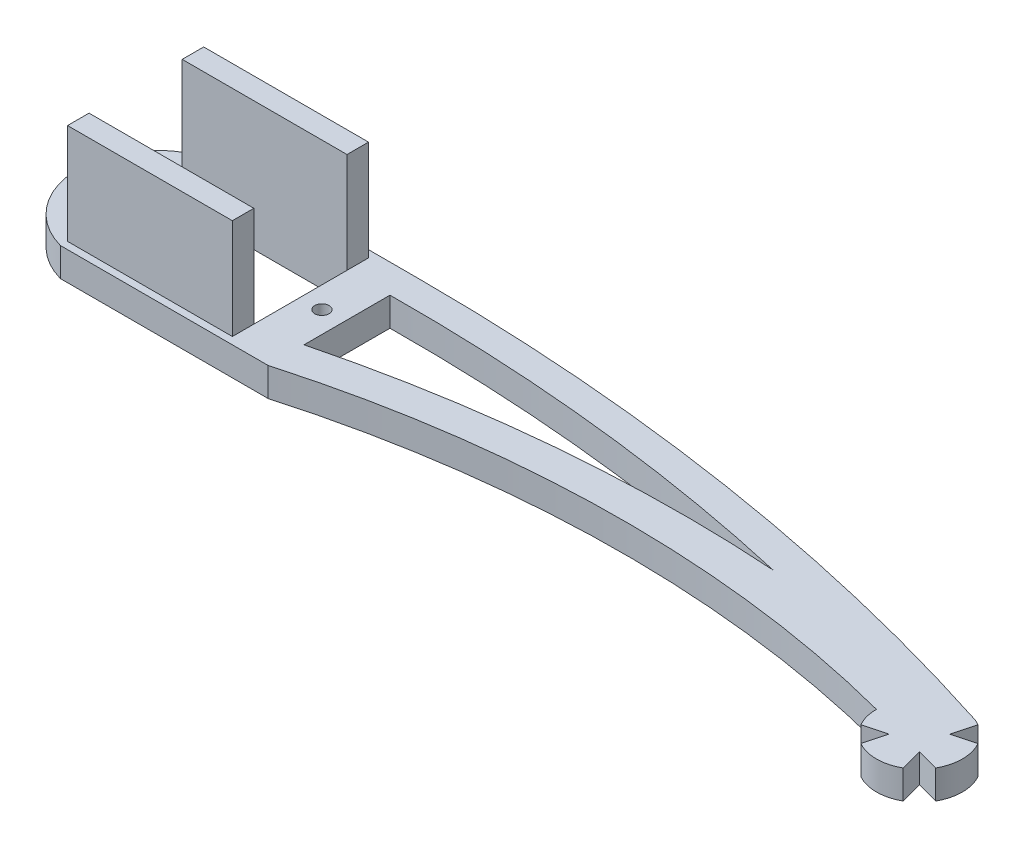
ISO-10303-21;
HEADER;
FILE_DESCRIPTION(('STEP AP214'),'2;1');
FILE_NAME('part.step','',(''),(''),'','','');
FILE_SCHEMA(('AUTOMOTIVE_DESIGN { 1 0 10303 214 1 1 1 1 }'));
ENDSEC;
DATA;
#1=APPLICATION_CONTEXT('core data for automotive mechanical design processes');
#2=APPLICATION_PROTOCOL_DEFINITION('international standard','automotive_design',2000,#1);
#3=PRODUCT_CONTEXT('',#1,'mechanical');
#4=PRODUCT('Part','Part','',(#3));
#5=PRODUCT_RELATED_PRODUCT_CATEGORY('part','',(#4));
#6=PRODUCT_DEFINITION_FORMATION('','',#4);
#7=PRODUCT_DEFINITION_CONTEXT('part definition',#1,'design');
#8=PRODUCT_DEFINITION('design','',#6,#7);
#9=PRODUCT_DEFINITION_SHAPE('','',#8);
#10=(LENGTH_UNIT() NAMED_UNIT(*) SI_UNIT(.MILLI.,.METRE.));
#11=(NAMED_UNIT(*) PLANE_ANGLE_UNIT() SI_UNIT($,.RADIAN.));
#12=(NAMED_UNIT(*) SI_UNIT($,.STERADIAN.) SOLID_ANGLE_UNIT());
#13=UNCERTAINTY_MEASURE_WITH_UNIT(LENGTH_MEASURE(1.E-05),#10,'distance_accuracy_value','');
#14=(GEOMETRIC_REPRESENTATION_CONTEXT(3) GLOBAL_UNCERTAINTY_ASSIGNED_CONTEXT((#13)) GLOBAL_UNIT_ASSIGNED_CONTEXT((#10,
#11,#12)) REPRESENTATION_CONTEXT('',''));
#15=CARTESIAN_POINT('',(0.,0.,0.));
#16=DIRECTION('',(0.,0.,1.));
#17=DIRECTION('',(1.,0.,0.));
#18=AXIS2_PLACEMENT_3D('',#15,#16,#17);
#19=CARTESIAN_POINT('',(0.,2.,0.));
#20=DIRECTION('',(0.,1.,0.));
#21=DIRECTION('',(0.,0.,1.));
#22=AXIS2_PLACEMENT_3D('',#19,#20,#21);
#23=PLANE('',#22);
#24=CARTESIAN_POINT('',(14.5,2.,0.));
#25=DIRECTION('',(0.,-1.,0.));
#26=DIRECTION('',(0.,0.,-1.));
#27=AXIS2_PLACEMENT_3D('',#24,#25,#26);
#28=CIRCLE('',#27,1.);
#29=CARTESIAN_POINT('',(14.5,2.,-1.));
#30=VERTEX_POINT('',#29);
#31=EDGE_CURVE('E349',#30,#30,#28,.T.);
#32=ORIENTED_EDGE('',*,*,#31,.T.);
#33=EDGE_LOOP('',(#32));
#34=FACE_BOUND('',#33,.T.);
#35=CARTESIAN_POINT('',(-14.5,2.,0.));
#36=DIRECTION('',(0.,-1.,0.));
#37=DIRECTION('',(0.,0.,-1.));
#38=AXIS2_PLACEMENT_3D('',#35,#36,#37);
#39=CIRCLE('',#38,1.);
#40=CARTESIAN_POINT('',(-14.5,2.,-1.));
#41=VERTEX_POINT('',#40);
#42=EDGE_CURVE('E346',#41,#41,#39,.T.);
#43=ORIENTED_EDGE('',*,*,#42,.T.);
#44=EDGE_LOOP('',(#43));
#45=FACE_BOUND('',#44,.T.);
#46=DIRECTION('',(-0.965925826289068,0.,0.258819045102521));
#47=VECTOR('',#46,1.);
#48=CARTESIAN_POINT('',(9.99294037609663,2.,37.294161200599));
#49=LINE('',#48,#47);
#50=CARTESIAN_POINT('',(105.37867965644,2.,11.7356293909852));
#51=VERTEX_POINT('',#50);
#52=CARTESIAN_POINT('',(102.27670660932,2.,12.5668005639042));
#53=VERTEX_POINT('',#52);
#54=EDGE_CURVE('E391',#51,#53,#49,.T.);
#55=ORIENTED_EDGE('',*,*,#54,.F.);
#56=DIRECTION('',(-0.258819045102517,0.,0.965925826289069));
#57=VECTOR('',#56,1.);
#58=CARTESIAN_POINT('',(101.253553975837,2.,27.1308080186061));
#59=LINE('',#58,#57);
#60=CARTESIAN_POINT('',(104.547508483521,2.,14.8376024381056));
#61=VERTEX_POINT('',#60);
#62=EDGE_CURVE('E397',#51,#61,#59,.T.);
#63=ORIENTED_EDGE('',*,*,#62,.T.);
#64=CARTESIAN_POINT('',(107.5,2.,9.61430904742555));
#65=DIRECTION('',(0.,1.,0.));
#66=DIRECTION('',(0.,0.,1.));
#67=AXIS2_PLACEMENT_3D('',#64,#65,#66);
#68=CIRCLE('',#67,6.00000000000002);
#69=CARTESIAN_POINT('',(110.452491516479,2.,14.8376024381056));
#70=VERTEX_POINT('',#69);
#71=EDGE_CURVE('E481',#61,#70,#68,.T.);
#72=ORIENTED_EDGE('',*,*,#71,.T.);
#73=DIRECTION('',(0.258819045102524,0.,0.965925826289067));
#74=VECTOR('',#73,1.);
#75=CARTESIAN_POINT('',(99.3441769309906,2.,-26.6191919813939));
#76=LINE('',#75,#74);
#77=CARTESIAN_POINT('',(109.62132034356,2.,11.7356293909852));
#78=VERTEX_POINT('',#77);
#79=EDGE_CURVE('E414',#78,#70,#76,.T.);
#80=ORIENTED_EDGE('',*,*,#79,.F.);
#81=DIRECTION('',(0.965925826289067,0.,0.258819045102525));
#82=VECTOR('',#81,1.);
#83=CARTESIAN_POINT('',(4.40932871707647,2.,-16.4558387994016));
#84=LINE('',#83,#82);
#85=CARTESIAN_POINT('',(112.72329339068,2.,12.5668005639042));
#86=VERTEX_POINT('',#85);
#87=EDGE_CURVE('E417',#78,#86,#84,.T.);
#88=ORIENTED_EDGE('',*,*,#87,.T.);
#89=CARTESIAN_POINT('',(112.72329339068,2.,6.66181753094687));
#90=VERTEX_POINT('',#89);
#91=EDGE_CURVE('E787',#86,#90,#68,.T.);
#92=ORIENTED_EDGE('',*,*,#91,.T.);
#93=DIRECTION('',(0.965925826289068,0.,-0.258819045102523));
#94=VECTOR('',#93,1.);
#95=CARTESIAN_POINT('',(9.2164832407892,2.,34.396383721732));
#96=LINE('',#95,#94);
#97=CARTESIAN_POINT('',(109.62132034356,2.,7.4929887038659));
#98=VERTEX_POINT('',#97);
#99=EDGE_CURVE('E431',#98,#90,#96,.T.);
#100=ORIENTED_EDGE('',*,*,#99,.F.);
#101=DIRECTION('',(0.258819045102529,0.,-0.965925826289066));
#102=VECTOR('',#101,1.);
#103=CARTESIAN_POINT('',(104.151331454703,2.,27.9072651539149));
#104=LINE('',#103,#102);
#105=CARTESIAN_POINT('',(110.452491516479,2.,4.39101565674553));
#106=VERTEX_POINT('',#105);
#107=EDGE_CURVE('E432',#98,#106,#104,.T.);
#108=ORIENTED_EDGE('',*,*,#107,.T.);
#109=CARTESIAN_POINT('',(109.336734693878,2.,3.90235617084239));
#110=VERTEX_POINT('',#109);
#111=EDGE_CURVE('E474',#106,#110,#68,.T.);
#112=ORIENTED_EDGE('',*,*,#111,.T.);
#113=CARTESIAN_POINT('',(17.5,2.,289.5));
#114=DIRECTION('',(0.,1.,0.));
#115=DIRECTION('',(0.,0.,1.));
#116=AXIS2_PLACEMENT_3D('',#113,#114,#115);
#117=CIRCLE('',#116,300.);
#118=CARTESIAN_POINT('',(17.5,2.,-10.5));
#119=VERTEX_POINT('',#118);
#120=EDGE_CURVE('E477',#119,#110,#117,.F.);
#121=ORIENTED_EDGE('',*,*,#120,.F.);
#122=DIRECTION('',(-1.,0.,0.));
#123=VECTOR('',#122,1.);
#124=CARTESIAN_POINT('',(0.,2.,-10.5));
#125=LINE('',#124,#123);
#126=CARTESIAN_POINT('',(-11.5,2.,-10.5));
#127=VERTEX_POINT('',#126);
#128=EDGE_CURVE('E514',#119,#127,#125,.T.);
#129=ORIENTED_EDGE('',*,*,#128,.T.);
#130=CARTESIAN_POINT('',(-8.60937499999999,2.,0.));
#131=DIRECTION('',(0.,1.,0.));
#132=DIRECTION('',(0.,0.,1.));
#133=AXIS2_PLACEMENT_3D('',#130,#131,#132);
#134=CIRCLE('',#133,10.890625);
#135=CARTESIAN_POINT('',(-11.5,2.,10.5));
#136=VERTEX_POINT('',#135);
#137=EDGE_CURVE('E504',#136,#127,#134,.F.);
#138=ORIENTED_EDGE('',*,*,#137,.F.);
#139=DIRECTION('',(-1.,0.,0.));
#140=VECTOR('',#139,1.);
#141=CARTESIAN_POINT('',(0.,2.,10.5));
#142=LINE('',#141,#140);
#143=CARTESIAN_POINT('',(17.5,2.,10.5));
#144=VERTEX_POINT('',#143);
#145=EDGE_CURVE('E502',#144,#136,#142,.T.);
#146=ORIENTED_EDGE('',*,*,#145,.F.);
#147=CARTESIAN_POINT('',(61.1277724137752,2.,164.437056858353));
#148=DIRECTION('',(0.,1.,0.));
#149=DIRECTION('',(0.,0.,1.));
#150=AXIS2_PLACEMENT_3D('',#147,#148,#149);
#151=CIRCLE('',#150,160.);
#152=CARTESIAN_POINT('',(101.5,2.,9.61430904742555));
#153=VERTEX_POINT('',#152);
#154=EDGE_CURVE('E473',#144,#153,#151,.F.);
#155=ORIENTED_EDGE('',*,*,#154,.T.);
#156=EDGE_CURVE('E478',#153,#53,#68,.T.);
#157=ORIENTED_EDGE('',*,*,#156,.T.);
#158=EDGE_LOOP('',(#55,#63,#72,#80,#88,#92,#100,#108,#112,#121,#129,#138,#146,#155,#157));
#159=FACE_BOUND('',#158,.T.);
#160=DIRECTION('',(0.,0.,-1.));
#161=VECTOR('',#160,1.);
#162=CARTESIAN_POINT('',(17.5,2.,0.));
#163=LINE('',#162,#161);
#164=CARTESIAN_POINT('',(17.5,2.,5.5));
#165=VERTEX_POINT('',#164);
#166=CARTESIAN_POINT('',(17.5,2.,-6.50000000000001));
#167=VERTEX_POINT('',#166);
#168=EDGE_CURVE('E507',#165,#167,#163,.T.);
#169=ORIENTED_EDGE('',*,*,#168,.T.);
#170=CARTESIAN_POINT('',(19.6864126009536,2.,253.490806760428));
#171=DIRECTION('',(0.,1.,0.));
#172=DIRECTION('',(0.,0.,1.));
#173=AXIS2_PLACEMENT_3D('',#170,#171,#172);
#174=CIRCLE('',#173,260.);
#175=CARTESIAN_POINT('',(77.5,2.,0.));
#176=VERTEX_POINT('',#175);
#177=EDGE_CURVE('E464',#167,#176,#174,.F.);
#178=ORIENTED_EDGE('',*,*,#177,.T.);
#179=CARTESIAN_POINT('',(64.6245471826558,2.,189.563241992609));
#180=DIRECTION('',(0.,1.,0.));
#181=DIRECTION('',(0.,0.,1.));
#182=AXIS2_PLACEMENT_3D('',#179,#180,#181);
#183=CIRCLE('',#182,190.);
#184=EDGE_CURVE('E411',#165,#176,#183,.F.);
#185=ORIENTED_EDGE('',*,*,#184,.F.);
#186=EDGE_LOOP('',(#169,#178,#185));
#187=FACE_BOUND('',#186,.T.);
#188=DIRECTION('',(0.,0.,-1.));
#189=VECTOR('',#188,1.);
#190=CARTESIAN_POINT('',(-11.5,2.,0.));
#191=LINE('',#190,#189);
#192=CARTESIAN_POINT('',(-11.5,2.,-3.));
#193=VERTEX_POINT('',#192);
#194=CARTESIAN_POINT('',(-11.5,2.,-6.5));
#195=VERTEX_POINT('',#194);
#196=EDGE_CURVE('E522',#193,#195,#191,.T.);
#197=ORIENTED_EDGE('',*,*,#196,.T.);
#198=DIRECTION('',(0.,0.,-1.));
#199=VECTOR('',#198,1.);
#200=CARTESIAN_POINT('',(-11.5,2.,-6.5));
#201=LINE('',#200,#199);
#202=CARTESIAN_POINT('',(-11.5,2.,-9.5));
#203=VERTEX_POINT('',#202);
#204=EDGE_CURVE('E266',#195,#203,#201,.T.);
#205=ORIENTED_EDGE('',*,*,#204,.T.);
#206=DIRECTION('',(1.,0.,0.));
#207=VECTOR('',#206,1.);
#208=CARTESIAN_POINT('',(-11.5,2.,-9.5));
#209=LINE('',#208,#207);
#210=CARTESIAN_POINT('',(11.5,2.,-9.5));
#211=VERTEX_POINT('',#210);
#212=EDGE_CURVE('E70',#203,#211,#209,.T.);
#213=ORIENTED_EDGE('',*,*,#212,.T.);
#214=DIRECTION('',(0.,0.,1.));
#215=VECTOR('',#214,1.);
#216=CARTESIAN_POINT('',(11.5,2.,-6.5));
#217=LINE('',#216,#215);
#218=CARTESIAN_POINT('',(11.5,2.,-6.5));
#219=VERTEX_POINT('',#218);
#220=EDGE_CURVE('E298',#211,#219,#217,.T.);
#221=ORIENTED_EDGE('',*,*,#220,.T.);
#222=DIRECTION('',(0.,0.,-1.));
#223=VECTOR('',#222,1.);
#224=CARTESIAN_POINT('',(11.5,2.,0.));
#225=LINE('',#224,#223);
#226=CARTESIAN_POINT('',(11.5,2.,6.5));
#227=VERTEX_POINT('',#226);
#228=EDGE_CURVE('E526',#227,#219,#225,.T.);
#229=ORIENTED_EDGE('',*,*,#228,.F.);
#230=DIRECTION('',(0.,0.,-1.));
#231=VECTOR('',#230,1.);
#232=CARTESIAN_POINT('',(11.5,2.,6.5));
#233=LINE('',#232,#231);
#234=CARTESIAN_POINT('',(11.5,2.,9.5));
#235=VERTEX_POINT('',#234);
#236=EDGE_CURVE('E316',#235,#227,#233,.T.);
#237=ORIENTED_EDGE('',*,*,#236,.F.);
#238=DIRECTION('',(1.,0.,0.));
#239=VECTOR('',#238,1.);
#240=CARTESIAN_POINT('',(-11.5,2.,9.5));
#241=LINE('',#240,#239);
#242=CARTESIAN_POINT('',(-11.5,2.,9.5));
#243=VERTEX_POINT('',#242);
#244=EDGE_CURVE('E74',#243,#235,#241,.T.);
#245=ORIENTED_EDGE('',*,*,#244,.F.);
#246=DIRECTION('',(0.,0.,1.));
#247=VECTOR('',#246,1.);
#248=CARTESIAN_POINT('',(-11.5,2.,6.5));
#249=LINE('',#248,#247);
#250=CARTESIAN_POINT('',(-11.5,2.,6.5));
#251=VERTEX_POINT('',#250);
#252=EDGE_CURVE('E271',#251,#243,#249,.T.);
#253=ORIENTED_EDGE('',*,*,#252,.F.);
#254=CARTESIAN_POINT('',(-11.5,2.,3.));
#255=VERTEX_POINT('',#254);
#256=EDGE_CURVE('E530',#251,#255,#191,.T.);
#257=ORIENTED_EDGE('',*,*,#256,.T.);
#258=DIRECTION('',(-1.,0.,0.));
#259=VECTOR('',#258,1.);
#260=CARTESIAN_POINT('',(0.,2.,3.));
#261=LINE('',#260,#259);
#262=CARTESIAN_POINT('',(-12.5,2.,3.));
#263=VERTEX_POINT('',#262);
#264=EDGE_CURVE('E531',#255,#263,#261,.T.);
#265=ORIENTED_EDGE('',*,*,#264,.T.);
#266=DIRECTION('',(0.,0.,1.));
#267=VECTOR('',#266,1.);
#268=CARTESIAN_POINT('',(-12.5,2.,0.));
#269=LINE('',#268,#267);
#270=CARTESIAN_POINT('',(-12.5,2.,-3.));
#271=VERTEX_POINT('',#270);
#272=EDGE_CURVE('E516',#271,#263,#269,.T.);
#273=ORIENTED_EDGE('',*,*,#272,.F.);
#274=DIRECTION('',(-1.,0.,0.));
#275=VECTOR('',#274,1.);
#276=CARTESIAN_POINT('',(0.,2.,-3.));
#277=LINE('',#276,#275);
#278=EDGE_CURVE('E523',#193,#271,#277,.T.);
#279=ORIENTED_EDGE('',*,*,#278,.F.);
#280=EDGE_LOOP('',(#197,#205,#213,#221,#229,#237,#245,#253,#257,#265,#273,#279));
#281=FACE_BOUND('',#280,.T.);
#282=ADVANCED_FACE('F50',(#34,#45,#159,#187,#281),#23,.T.);
#283=CARTESIAN_POINT('',(0.,-2.,0.));
#284=DIRECTION('',(0.,1.,0.));
#285=DIRECTION('',(0.,0.,1.));
#286=AXIS2_PLACEMENT_3D('',#283,#284,#285);
#287=PLANE('',#286);
#288=DIRECTION('',(-0.258819045102517,0.,0.965925826289069));
#289=VECTOR('',#288,1.);
#290=CARTESIAN_POINT('',(101.253553975837,-2.,27.1308080186061));
#291=LINE('',#290,#289);
#292=CARTESIAN_POINT('',(105.37867965644,-2.,11.7356293909852));
#293=VERTEX_POINT('',#292);
#294=CARTESIAN_POINT('',(104.547508483521,-2.,14.8376024381056));
#295=VERTEX_POINT('',#294);
#296=EDGE_CURVE('E402',#293,#295,#291,.T.);
#297=ORIENTED_EDGE('',*,*,#296,.F.);
#298=DIRECTION('',(-0.965925826289068,0.,0.25881904510252));
#299=VECTOR('',#298,1.);
#300=CARTESIAN_POINT('',(105.37867965644,-2.,11.7356293909852));
#301=LINE('',#300,#299);
#302=CARTESIAN_POINT('',(102.27670660932,-2.,12.5668005639042));
#303=VERTEX_POINT('',#302);
#304=EDGE_CURVE('E429',#293,#303,#301,.T.);
#305=ORIENTED_EDGE('',*,*,#304,.T.);
#306=CARTESIAN_POINT('',(107.5,-2.,9.61430904742555));
#307=DIRECTION('',(0.,1.,0.));
#308=DIRECTION('',(0.,0.,1.));
#309=AXIS2_PLACEMENT_3D('',#306,#307,#308);
#310=CIRCLE('',#309,6.00000000000002);
#311=CARTESIAN_POINT('',(101.5,-2.,9.61430904742555));
#312=VERTEX_POINT('',#311);
#313=EDGE_CURVE('E625',#312,#303,#310,.T.);
#314=ORIENTED_EDGE('',*,*,#313,.F.);
#315=CARTESIAN_POINT('',(61.1277724137752,-2.,164.437056858353));
#316=DIRECTION('',(0.,1.,0.));
#317=DIRECTION('',(0.,0.,1.));
#318=AXIS2_PLACEMENT_3D('',#315,#316,#317);
#319=CIRCLE('',#318,160.);
#320=CARTESIAN_POINT('',(17.5,-2.,10.5));
#321=VERTEX_POINT('',#320);
#322=EDGE_CURVE('E458',#321,#312,#319,.F.);
#323=ORIENTED_EDGE('',*,*,#322,.F.);
#324=DIRECTION('',(-1.,0.,0.));
#325=VECTOR('',#324,1.);
#326=CARTESIAN_POINT('',(0.,-2.,10.5));
#327=LINE('',#326,#325);
#328=CARTESIAN_POINT('',(-11.5,-2.,10.5));
#329=VERTEX_POINT('',#328);
#330=EDGE_CURVE('E539',#321,#329,#327,.T.);
#331=ORIENTED_EDGE('',*,*,#330,.T.);
#332=CARTESIAN_POINT('',(-8.60937499999999,-2.,0.));
#333=DIRECTION('',(0.,1.,0.));
#334=DIRECTION('',(0.,0.,1.));
#335=AXIS2_PLACEMENT_3D('',#332,#333,#334);
#336=CIRCLE('',#335,10.890625);
#337=CARTESIAN_POINT('',(-11.5,-2.,-10.5));
#338=VERTEX_POINT('',#337);
#339=EDGE_CURVE('E491',#329,#338,#336,.F.);
#340=ORIENTED_EDGE('',*,*,#339,.T.);
#341=DIRECTION('',(-1.,0.,0.));
#342=VECTOR('',#341,1.);
#343=CARTESIAN_POINT('',(0.,-2.,-10.5));
#344=LINE('',#343,#342);
#345=CARTESIAN_POINT('',(17.5,-2.,-10.5));
#346=VERTEX_POINT('',#345);
#347=EDGE_CURVE('E547',#346,#338,#344,.T.);
#348=ORIENTED_EDGE('',*,*,#347,.F.);
#349=CARTESIAN_POINT('',(17.5,-2.,289.5));
#350=DIRECTION('',(0.,1.,0.));
#351=DIRECTION('',(0.,0.,1.));
#352=AXIS2_PLACEMENT_3D('',#349,#350,#351);
#353=CIRCLE('',#352,300.);
#354=CARTESIAN_POINT('',(109.336734693878,-2.,3.90235617084239));
#355=VERTEX_POINT('',#354);
#356=EDGE_CURVE('E470',#346,#355,#353,.F.);
#357=ORIENTED_EDGE('',*,*,#356,.T.);
#358=CARTESIAN_POINT('',(107.5,-2.,9.61430904742555));
#359=DIRECTION('',(0.,1.,0.));
#360=DIRECTION('',(0.,0.,1.));
#361=AXIS2_PLACEMENT_3D('',#358,#359,#360);
#362=CIRCLE('',#361,6.00000000000002);
#363=CARTESIAN_POINT('',(110.452491516479,-2.,4.39101565674553));
#364=VERTEX_POINT('',#363);
#365=EDGE_CURVE('E616',#364,#355,#362,.T.);
#366=ORIENTED_EDGE('',*,*,#365,.F.);
#367=DIRECTION('',(0.258819045102529,0.,-0.965925826289066));
#368=VECTOR('',#367,1.);
#369=CARTESIAN_POINT('',(104.151331454703,-2.,27.9072651539149));
#370=LINE('',#369,#368);
#371=CARTESIAN_POINT('',(109.62132034356,-2.,7.4929887038659));
#372=VERTEX_POINT('',#371);
#373=EDGE_CURVE('E434',#372,#364,#370,.T.);
#374=ORIENTED_EDGE('',*,*,#373,.F.);
#375=DIRECTION('',(0.965925826289068,0.,-0.258819045102523));
#376=VECTOR('',#375,1.);
#377=CARTESIAN_POINT('',(109.62132034356,-2.,7.49298870386588));
#378=LINE('',#377,#376);
#379=CARTESIAN_POINT('',(112.72329339068,-2.,6.66181753094687));
#380=VERTEX_POINT('',#379);
#381=EDGE_CURVE('E355',#372,#380,#378,.T.);
#382=ORIENTED_EDGE('',*,*,#381,.T.);
#383=CARTESIAN_POINT('',(107.5,-2.,9.61430904742555));
#384=DIRECTION('',(0.,1.,0.));
#385=DIRECTION('',(0.,0.,1.));
#386=AXIS2_PLACEMENT_3D('',#383,#384,#385);
#387=CIRCLE('',#386,6.00000000000002);
#388=CARTESIAN_POINT('',(112.72329339068,-2.,12.5668005639042));
#389=VERTEX_POINT('',#388);
#390=EDGE_CURVE('E648',#389,#380,#387,.T.);
#391=ORIENTED_EDGE('',*,*,#390,.F.);
#392=DIRECTION('',(0.965925826289067,0.,0.258819045102525));
#393=VECTOR('',#392,1.);
#394=CARTESIAN_POINT('',(4.40932871707647,-2.,-16.4558387994016));
#395=LINE('',#394,#393);
#396=CARTESIAN_POINT('',(109.62132034356,-2.,11.7356293909852));
#397=VERTEX_POINT('',#396);
#398=EDGE_CURVE('E416',#397,#389,#395,.T.);
#399=ORIENTED_EDGE('',*,*,#398,.F.);
#400=DIRECTION('',(0.258819045102525,0.,0.965925826289067));
#401=VECTOR('',#400,1.);
#402=CARTESIAN_POINT('',(109.62132034356,-2.,11.7356293909852));
#403=LINE('',#402,#401);
#404=CARTESIAN_POINT('',(110.452491516479,-2.,14.8376024381056));
#405=VERTEX_POINT('',#404);
#406=EDGE_CURVE('E446',#397,#405,#403,.T.);
#407=ORIENTED_EDGE('',*,*,#406,.T.);
#408=CARTESIAN_POINT('',(107.5,-2.,9.61430904742555));
#409=DIRECTION('',(0.,1.,0.));
#410=DIRECTION('',(0.,0.,1.));
#411=AXIS2_PLACEMENT_3D('',#408,#409,#410);
#412=CIRCLE('',#411,6.00000000000002);
#413=EDGE_CURVE('E644',#295,#405,#412,.T.);
#414=ORIENTED_EDGE('',*,*,#413,.F.);
#415=EDGE_LOOP('',(#297,#305,#314,#323,#331,#340,#348,#357,#366,#374,#382,#391,#399,#407,#414));
#416=FACE_BOUND('',#415,.T.);
#417=CARTESIAN_POINT('',(19.6864126009536,-2.,253.490806760428));
#418=DIRECTION('',(0.,1.,0.));
#419=DIRECTION('',(0.,0.,1.));
#420=AXIS2_PLACEMENT_3D('',#417,#418,#419);
#421=CIRCLE('',#420,260.);
#422=CARTESIAN_POINT('',(17.5,-2.,-6.5));
#423=VERTEX_POINT('',#422);
#424=CARTESIAN_POINT('',(77.5,-2.,0.));
#425=VERTEX_POINT('',#424);
#426=EDGE_CURVE('E461',#423,#425,#421,.F.);
#427=ORIENTED_EDGE('',*,*,#426,.F.);
#428=DIRECTION('',(0.,0.,-1.));
#429=VECTOR('',#428,1.);
#430=CARTESIAN_POINT('',(17.5,-2.,0.));
#431=LINE('',#430,#429);
#432=CARTESIAN_POINT('',(17.5,-2.,5.50000000000001));
#433=VERTEX_POINT('',#432);
#434=EDGE_CURVE('E542',#433,#423,#431,.T.);
#435=ORIENTED_EDGE('',*,*,#434,.F.);
#436=CARTESIAN_POINT('',(64.6245471826558,-2.,189.563241992609));
#437=DIRECTION('',(0.,1.,0.));
#438=DIRECTION('',(0.,0.,1.));
#439=AXIS2_PLACEMENT_3D('',#436,#437,#438);
#440=CIRCLE('',#439,190.);
#441=EDGE_CURVE('E460',#433,#425,#440,.F.);
#442=ORIENTED_EDGE('',*,*,#441,.T.);
#443=EDGE_LOOP('',(#427,#435,#442));
#444=FACE_BOUND('',#443,.T.);
#445=DIRECTION('',(0.,0.,1.));
#446=VECTOR('',#445,1.);
#447=CARTESIAN_POINT('',(-12.5,-2.,0.));
#448=LINE('',#447,#446);
#449=CARTESIAN_POINT('',(-12.5,-2.,-3.));
#450=VERTEX_POINT('',#449);
#451=CARTESIAN_POINT('',(-12.5,-2.,3.));
#452=VERTEX_POINT('',#451);
#453=EDGE_CURVE('E555',#450,#452,#448,.T.);
#454=ORIENTED_EDGE('',*,*,#453,.T.);
#455=DIRECTION('',(-1.,0.,0.));
#456=VECTOR('',#455,1.);
#457=CARTESIAN_POINT('',(0.,-2.,3.));
#458=LINE('',#457,#456);
#459=CARTESIAN_POINT('',(-11.5,-2.,3.));
#460=VERTEX_POINT('',#459);
#461=EDGE_CURVE('E508',#460,#452,#458,.T.);
#462=ORIENTED_EDGE('',*,*,#461,.F.);
#463=DIRECTION('',(0.,0.,-1.));
#464=VECTOR('',#463,1.);
#465=CARTESIAN_POINT('',(-11.5,-2.,0.));
#466=LINE('',#465,#464);
#467=CARTESIAN_POINT('',(-11.5,-2.,6.5));
#468=VERTEX_POINT('',#467);
#469=EDGE_CURVE('E562',#468,#460,#466,.T.);
#470=ORIENTED_EDGE('',*,*,#469,.F.);
#471=DIRECTION('',(1.,0.,0.));
#472=VECTOR('',#471,1.);
#473=CARTESIAN_POINT('',(0.,-2.,6.5));
#474=LINE('',#473,#472);
#475=CARTESIAN_POINT('',(11.5,-2.,6.5));
#476=VERTEX_POINT('',#475);
#477=EDGE_CURVE('E571',#468,#476,#474,.T.);
#478=ORIENTED_EDGE('',*,*,#477,.T.);
#479=DIRECTION('',(0.,0.,-1.));
#480=VECTOR('',#479,1.);
#481=CARTESIAN_POINT('',(11.5,-2.,0.));
#482=LINE('',#481,#480);
#483=CARTESIAN_POINT('',(11.5,-2.,-6.5));
#484=VERTEX_POINT('',#483);
#485=EDGE_CURVE('E566',#476,#484,#482,.T.);
#486=ORIENTED_EDGE('',*,*,#485,.T.);
#487=DIRECTION('',(1.,0.,0.));
#488=VECTOR('',#487,1.);
#489=CARTESIAN_POINT('',(0.,-2.,-6.5));
#490=LINE('',#489,#488);
#491=CARTESIAN_POINT('',(-11.5,-2.,-6.5));
#492=VERTEX_POINT('',#491);
#493=EDGE_CURVE('E564',#492,#484,#490,.T.);
#494=ORIENTED_EDGE('',*,*,#493,.F.);
#495=CARTESIAN_POINT('',(-11.5,-2.,-3.));
#496=VERTEX_POINT('',#495);
#497=EDGE_CURVE('E557',#496,#492,#466,.T.);
#498=ORIENTED_EDGE('',*,*,#497,.F.);
#499=DIRECTION('',(-1.,0.,0.));
#500=VECTOR('',#499,1.);
#501=CARTESIAN_POINT('',(0.,-2.,-3.));
#502=LINE('',#501,#500);
#503=EDGE_CURVE('E559',#496,#450,#502,.T.);
#504=ORIENTED_EDGE('',*,*,#503,.T.);
#505=EDGE_LOOP('',(#454,#462,#470,#478,#486,#494,#498,#504));
#506=FACE_BOUND('',#505,.T.);
#507=CARTESIAN_POINT('',(-14.5,-2.000012,0.));
#508=DIRECTION('',(0.,-1.,0.));
#509=DIRECTION('',(0.,0.,-1.));
#510=AXIS2_PLACEMENT_3D('',#507,#508,#509);
#511=CIRCLE('',#510,1.);
#512=CARTESIAN_POINT('',(-14.5,-2.000012,-1.));
#513=VERTEX_POINT('',#512);
#514=EDGE_CURVE('E356',#513,#513,#511,.T.);
#515=ORIENTED_EDGE('',*,*,#514,.F.);
#516=EDGE_LOOP('',(#515));
#517=FACE_BOUND('',#516,.T.);
#518=CARTESIAN_POINT('',(14.5,-2.000012,0.));
#519=DIRECTION('',(0.,-1.,0.));
#520=DIRECTION('',(0.,0.,-1.));
#521=AXIS2_PLACEMENT_3D('',#518,#519,#520);
#522=CIRCLE('',#521,1.);
#523=CARTESIAN_POINT('',(14.5,-2.000012,-1.));
#524=VERTEX_POINT('',#523);
#525=EDGE_CURVE('E353',#524,#524,#522,.T.);
#526=ORIENTED_EDGE('',*,*,#525,.F.);
#527=EDGE_LOOP('',(#526));
#528=FACE_BOUND('',#527,.T.);
#529=ADVANCED_FACE('F658',(#416,#444,#506,#517,#528),#287,.F.);
#530=CARTESIAN_POINT('',(107.5,-2.,9.61430904742555));
#531=DIRECTION('',(0.,1.,0.));
#532=DIRECTION('',(0.,0.,1.));
#533=AXIS2_PLACEMENT_3D('',#530,#531,#532);
#534=CYLINDRICAL_SURFACE('',#533,6.00000000000002);
#535=ORIENTED_EDGE('',*,*,#71,.F.);
#536=DIRECTION('',(0.,-1.,0.));
#537=VECTOR('',#536,1.);
#538=CARTESIAN_POINT('',(104.547508483521,2.,14.8376024381056));
#539=LINE('',#538,#537);
#540=EDGE_CURVE('E409',#61,#295,#539,.T.);
#541=ORIENTED_EDGE('',*,*,#540,.T.);
#542=ORIENTED_EDGE('',*,*,#413,.T.);
#543=DIRECTION('',(0.,-1.,0.));
#544=VECTOR('',#543,1.);
#545=CARTESIAN_POINT('',(110.452491516479,2.,14.8376024381056));
#546=LINE('',#545,#544);
#547=EDGE_CURVE('E430',#70,#405,#546,.T.);
#548=ORIENTED_EDGE('',*,*,#547,.F.);
#549=EDGE_LOOP('',(#535,#541,#542,#548));
#550=FACE_BOUND('',#549,.T.);
#551=ADVANCED_FACE('F668',(#550),#534,.T.);
#552=ORIENTED_EDGE('',*,*,#91,.F.);
#553=DIRECTION('',(0.,-1.,0.));
#554=VECTOR('',#553,1.);
#555=CARTESIAN_POINT('',(112.72329339068,2.,12.5668005639042));
#556=LINE('',#555,#554);
#557=EDGE_CURVE('E421',#86,#389,#556,.T.);
#558=ORIENTED_EDGE('',*,*,#557,.T.);
#559=ORIENTED_EDGE('',*,*,#390,.T.);
#560=DIRECTION('',(0.,-1.,0.));
#561=VECTOR('',#560,1.);
#562=CARTESIAN_POINT('',(112.72329339068,2.,6.66181753094687));
#563=LINE('',#562,#561);
#564=EDGE_CURVE('E441',#90,#380,#563,.T.);
#565=ORIENTED_EDGE('',*,*,#564,.F.);
#566=EDGE_LOOP('',(#552,#558,#559,#565));
#567=FACE_BOUND('',#566,.T.);
#568=ADVANCED_FACE('F838',(#567),#534,.T.);
#569=ORIENTED_EDGE('',*,*,#111,.F.);
#570=DIRECTION('',(0.,-1.,0.));
#571=VECTOR('',#570,1.);
#572=CARTESIAN_POINT('',(110.452491516479,2.,4.39101565674553));
#573=LINE('',#572,#571);
#574=EDGE_CURVE('E439',#106,#364,#573,.T.);
#575=ORIENTED_EDGE('',*,*,#574,.T.);
#576=ORIENTED_EDGE('',*,*,#365,.T.);
#577=DIRECTION('',(0.,1.,0.));
#578=VECTOR('',#577,1.);
#579=CARTESIAN_POINT('',(109.336734693878,-2.,3.90235617084239));
#580=LINE('',#579,#578);
#581=EDGE_CURVE('E497',#355,#110,#580,.T.);
#582=ORIENTED_EDGE('',*,*,#581,.T.);
#583=EDGE_LOOP('',(#569,#575,#576,#582));
#584=FACE_BOUND('',#583,.T.);
#585=ADVANCED_FACE('F708',(#584),#534,.T.);
#586=CARTESIAN_POINT('',(17.5,2.,0.));
#587=DIRECTION('',(-1.,0.,0.));
#588=DIRECTION('',(0.,0.,1.));
#589=AXIS2_PLACEMENT_3D('',#586,#587,#588);
#590=PLANE('',#589);
#591=ORIENTED_EDGE('',*,*,#434,.T.);
#592=DIRECTION('',(0.,1.,0.));
#593=VECTOR('',#592,1.);
#594=CARTESIAN_POINT('',(17.5,-2.,-6.5));
#595=LINE('',#594,#593);
#596=EDGE_CURVE('E495',#423,#167,#595,.T.);
#597=ORIENTED_EDGE('',*,*,#596,.T.);
#598=ORIENTED_EDGE('',*,*,#168,.F.);
#599=DIRECTION('',(0.,1.,0.));
#600=VECTOR('',#599,1.);
#601=CARTESIAN_POINT('',(17.5,-2.,5.5));
#602=LINE('',#601,#600);
#603=EDGE_CURVE('E468',#433,#165,#602,.T.);
#604=ORIENTED_EDGE('',*,*,#603,.F.);
#605=EDGE_LOOP('',(#591,#597,#598,#604));
#606=FACE_BOUND('',#605,.T.);
#607=ADVANCED_FACE('F701',(#606),#590,.F.);
#608=CARTESIAN_POINT('',(-12.5,2.,0.));
#609=DIRECTION('',(1.,0.,0.));
#610=DIRECTION('',(0.,0.,-1.));
#611=AXIS2_PLACEMENT_3D('',#608,#609,#610);
#612=PLANE('',#611);
#613=ORIENTED_EDGE('',*,*,#453,.F.);
#614=DIRECTION('',(0.,-1.,0.));
#615=VECTOR('',#614,1.);
#616=CARTESIAN_POINT('',(-12.5,2.,-3.));
#617=LINE('',#616,#615);
#618=EDGE_CURVE('E11',#271,#450,#617,.T.);
#619=ORIENTED_EDGE('',*,*,#618,.F.);
#620=ORIENTED_EDGE('',*,*,#272,.T.);
#621=DIRECTION('',(0.,-1.,0.));
#622=VECTOR('',#621,1.);
#623=CARTESIAN_POINT('',(-12.5,2.,3.));
#624=LINE('',#623,#622);
#625=EDGE_CURVE('E579',#263,#452,#624,.T.);
#626=ORIENTED_EDGE('',*,*,#625,.T.);
#627=EDGE_LOOP('',(#613,#619,#620,#626));
#628=FACE_BOUND('',#627,.T.);
#629=ADVANCED_FACE('F700',(#628),#612,.T.);
#630=CARTESIAN_POINT('',(0.,2.,-3.));
#631=DIRECTION('',(0.,0.,1.));
#632=DIRECTION('',(1.,0.,0.));
#633=AXIS2_PLACEMENT_3D('',#630,#631,#632);
#634=PLANE('',#633);
#635=ORIENTED_EDGE('',*,*,#503,.F.);
#636=DIRECTION('',(0.,-1.,0.));
#637=VECTOR('',#636,1.);
#638=CARTESIAN_POINT('',(-11.5,2.,-3.));
#639=LINE('',#638,#637);
#640=EDGE_CURVE('E56',#193,#496,#639,.T.);
#641=ORIENTED_EDGE('',*,*,#640,.F.);
#642=ORIENTED_EDGE('',*,*,#278,.T.);
#643=ORIENTED_EDGE('',*,*,#618,.T.);
#644=EDGE_LOOP('',(#635,#641,#642,#643));
#645=FACE_BOUND('',#644,.T.);
#646=ADVANCED_FACE('F695',(#645),#634,.T.);
#647=CARTESIAN_POINT('',(-11.5,2.,0.));
#648=DIRECTION('',(-1.,0.,0.));
#649=DIRECTION('',(0.,0.,1.));
#650=AXIS2_PLACEMENT_3D('',#647,#648,#649);
#651=PLANE('',#650);
#652=ORIENTED_EDGE('',*,*,#497,.T.);
#653=DIRECTION('',(0.,-1.,0.));
#654=VECTOR('',#653,1.);
#655=CARTESIAN_POINT('',(-11.5,2.,-6.5));
#656=LINE('',#655,#654);
#657=EDGE_CURVE('E596',#195,#492,#656,.T.);
#658=ORIENTED_EDGE('',*,*,#657,.F.);
#659=ORIENTED_EDGE('',*,*,#196,.F.);
#660=ORIENTED_EDGE('',*,*,#640,.T.);
#661=EDGE_LOOP('',(#652,#658,#659,#660));
#662=FACE_BOUND('',#661,.T.);
#663=ADVANCED_FACE('F683',(#662),#651,.F.);
#664=CARTESIAN_POINT('',(0.,2.,-6.5));
#665=DIRECTION('',(0.,0.,-1.));
#666=DIRECTION('',(-1.,0.,0.));
#667=AXIS2_PLACEMENT_3D('',#664,#665,#666);
#668=PLANE('',#667);
#669=ORIENTED_EDGE('',*,*,#493,.T.);
#670=DIRECTION('',(0.,-1.,0.));
#671=VECTOR('',#670,1.);
#672=CARTESIAN_POINT('',(11.5,2.,-6.5));
#673=LINE('',#672,#671);
#674=EDGE_CURVE('E593',#219,#484,#673,.T.);
#675=ORIENTED_EDGE('',*,*,#674,.F.);
#676=DIRECTION('',(0.,-1.,0.));
#677=VECTOR('',#676,1.);
#678=CARTESIAN_POINT('',(11.5,16.,-6.5));
#679=LINE('',#678,#677);
#680=CARTESIAN_POINT('',(11.5,16.,-6.5));
#681=VERTEX_POINT('',#680);
#682=EDGE_CURVE('E275',#681,#219,#679,.T.);
#683=ORIENTED_EDGE('',*,*,#682,.F.);
#684=DIRECTION('',(-1.,0.,0.));
#685=VECTOR('',#684,1.);
#686=CARTESIAN_POINT('',(-11.5,16.,-6.5));
#687=LINE('',#686,#685);
#688=CARTESIAN_POINT('',(-11.5,16.,-6.5));
#689=VERTEX_POINT('',#688);
#690=EDGE_CURVE('E279',#681,#689,#687,.T.);
#691=ORIENTED_EDGE('',*,*,#690,.T.);
#692=DIRECTION('',(0.,-1.,0.));
#693=VECTOR('',#692,1.);
#694=CARTESIAN_POINT('',(-11.5,16.,-6.5));
#695=LINE('',#694,#693);
#696=EDGE_CURVE('E257',#689,#195,#695,.T.);
#697=ORIENTED_EDGE('',*,*,#696,.T.);
#698=ORIENTED_EDGE('',*,*,#657,.T.);
#699=EDGE_LOOP('',(#669,#675,#683,#691,#697,#698));
#700=FACE_BOUND('',#699,.T.);
#701=ADVANCED_FACE('F282',(#700),#668,.F.);
#702=CARTESIAN_POINT('',(11.5,2.,0.));
#703=DIRECTION('',(-1.,0.,0.));
#704=DIRECTION('',(0.,0.,1.));
#705=AXIS2_PLACEMENT_3D('',#702,#703,#704);
#706=PLANE('',#705);
#707=ORIENTED_EDGE('',*,*,#485,.F.);
#708=DIRECTION('',(0.,-1.,0.));
#709=VECTOR('',#708,1.);
#710=CARTESIAN_POINT('',(11.5,2.,6.5));
#711=LINE('',#710,#709);
#712=EDGE_CURVE('E587',#227,#476,#711,.T.);
#713=ORIENTED_EDGE('',*,*,#712,.F.);
#714=ORIENTED_EDGE('',*,*,#228,.T.);
#715=ORIENTED_EDGE('',*,*,#674,.T.);
#716=EDGE_LOOP('',(#707,#713,#714,#715));
#717=FACE_BOUND('',#716,.T.);
#718=ADVANCED_FACE('F690',(#717),#706,.T.);
#719=CARTESIAN_POINT('',(0.,2.,6.5));
#720=DIRECTION('',(0.,0.,-1.));
#721=DIRECTION('',(-1.,0.,0.));
#722=AXIS2_PLACEMENT_3D('',#719,#720,#721);
#723=PLANE('',#722);
#724=ORIENTED_EDGE('',*,*,#477,.F.);
#725=DIRECTION('',(0.,-1.,0.));
#726=VECTOR('',#725,1.);
#727=CARTESIAN_POINT('',(-11.5,2.,6.5));
#728=LINE('',#727,#726);
#729=EDGE_CURVE('E590',#251,#468,#728,.T.);
#730=ORIENTED_EDGE('',*,*,#729,.F.);
#731=DIRECTION('',(0.,-1.,0.));
#732=VECTOR('',#731,1.);
#733=CARTESIAN_POINT('',(-11.5,16.,6.5));
#734=LINE('',#733,#732);
#735=CARTESIAN_POINT('',(-11.5,16.,6.5));
#736=VERTEX_POINT('',#735);
#737=EDGE_CURVE('E324',#736,#251,#734,.T.);
#738=ORIENTED_EDGE('',*,*,#737,.F.);
#739=DIRECTION('',(-1.,0.,0.));
#740=VECTOR('',#739,1.);
#741=CARTESIAN_POINT('',(-11.5,16.,6.5));
#742=LINE('',#741,#740);
#743=CARTESIAN_POINT('',(11.5,16.,6.5));
#744=VERTEX_POINT('',#743);
#745=EDGE_CURVE('E325',#744,#736,#742,.T.);
#746=ORIENTED_EDGE('',*,*,#745,.F.);
#747=DIRECTION('',(0.,-1.,0.));
#748=VECTOR('',#747,1.);
#749=CARTESIAN_POINT('',(11.5,16.,6.5));
#750=LINE('',#749,#748);
#751=EDGE_CURVE('E336',#744,#227,#750,.T.);
#752=ORIENTED_EDGE('',*,*,#751,.T.);
#753=ORIENTED_EDGE('',*,*,#712,.T.);
#754=EDGE_LOOP('',(#724,#730,#738,#746,#752,#753));
#755=FACE_BOUND('',#754,.T.);
#756=ADVANCED_FACE('F681',(#755),#723,.T.);
#757=ORIENTED_EDGE('',*,*,#469,.T.);
#758=DIRECTION('',(0.,-1.,0.));
#759=VECTOR('',#758,1.);
#760=CARTESIAN_POINT('',(-11.5,2.,3.));
#761=LINE('',#760,#759);
#762=EDGE_CURVE('E582',#255,#460,#761,.T.);
#763=ORIENTED_EDGE('',*,*,#762,.F.);
#764=ORIENTED_EDGE('',*,*,#256,.F.);
#765=ORIENTED_EDGE('',*,*,#729,.T.);
#766=EDGE_LOOP('',(#757,#763,#764,#765));
#767=FACE_BOUND('',#766,.T.);
#768=ADVANCED_FACE('F679',(#767),#651,.F.);
#769=CARTESIAN_POINT('',(-8.60937499999999,2.,0.));
#770=DIRECTION('',(0.,-1.,0.));
#771=DIRECTION('',(0.,0.,-1.));
#772=AXIS2_PLACEMENT_3D('',#769,#770,#771);
#773=CYLINDRICAL_SURFACE('',#772,10.890625);
#774=ORIENTED_EDGE('',*,*,#339,.F.);
#775=DIRECTION('',(0.,-1.,0.));
#776=VECTOR('',#775,1.);
#777=CARTESIAN_POINT('',(-11.5,2.,10.5));
#778=LINE('',#777,#776);
#779=EDGE_CURVE('E581',#136,#329,#778,.T.);
#780=ORIENTED_EDGE('',*,*,#779,.F.);
#781=ORIENTED_EDGE('',*,*,#137,.T.);
#782=DIRECTION('',(0.,-1.,0.));
#783=VECTOR('',#782,1.);
#784=CARTESIAN_POINT('',(-11.5,2.,-10.5));
#785=LINE('',#784,#783);
#786=EDGE_CURVE('E536',#127,#338,#785,.T.);
#787=ORIENTED_EDGE('',*,*,#786,.T.);
#788=EDGE_LOOP('',(#774,#780,#781,#787));
#789=FACE_BOUND('',#788,.T.);
#790=ADVANCED_FACE('F47',(#789),#773,.T.);
#791=CARTESIAN_POINT('',(0.,2.,10.5));
#792=DIRECTION('',(0.,0.,1.));
#793=DIRECTION('',(1.,0.,0.));
#794=AXIS2_PLACEMENT_3D('',#791,#792,#793);
#795=PLANE('',#794);
#796=ORIENTED_EDGE('',*,*,#330,.F.);
#797=DIRECTION('',(0.,-1.,0.));
#798=VECTOR('',#797,1.);
#799=CARTESIAN_POINT('',(17.5,2.,10.5));
#800=LINE('',#799,#798);
#801=EDGE_CURVE('E610',#144,#321,#800,.T.);
#802=ORIENTED_EDGE('',*,*,#801,.F.);
#803=ORIENTED_EDGE('',*,*,#145,.T.);
#804=ORIENTED_EDGE('',*,*,#779,.T.);
#805=EDGE_LOOP('',(#796,#802,#803,#804));
#806=FACE_BOUND('',#805,.T.);
#807=ADVANCED_FACE('F704',(#806),#795,.T.);
#808=CARTESIAN_POINT('',(0.,2.,-10.5));
#809=DIRECTION('',(0.,0.,1.));
#810=DIRECTION('',(1.,0.,0.));
#811=AXIS2_PLACEMENT_3D('',#808,#809,#810);
#812=PLANE('',#811);
#813=ORIENTED_EDGE('',*,*,#347,.T.);
#814=ORIENTED_EDGE('',*,*,#786,.F.);
#815=ORIENTED_EDGE('',*,*,#128,.F.);
#816=DIRECTION('',(0.,-1.,0.));
#817=VECTOR('',#816,1.);
#818=CARTESIAN_POINT('',(17.5,2.,-10.5));
#819=LINE('',#818,#817);
#820=EDGE_CURVE('E602',#119,#346,#819,.T.);
#821=ORIENTED_EDGE('',*,*,#820,.T.);
#822=EDGE_LOOP('',(#813,#814,#815,#821));
#823=FACE_BOUND('',#822,.T.);
#824=ADVANCED_FACE('F680',(#823),#812,.F.);
#825=CARTESIAN_POINT('',(0.,2.,3.));
#826=DIRECTION('',(0.,0.,1.));
#827=DIRECTION('',(1.,0.,0.));
#828=AXIS2_PLACEMENT_3D('',#825,#826,#827);
#829=PLANE('',#828);
#830=ORIENTED_EDGE('',*,*,#461,.T.);
#831=ORIENTED_EDGE('',*,*,#625,.F.);
#832=ORIENTED_EDGE('',*,*,#264,.F.);
#833=ORIENTED_EDGE('',*,*,#762,.T.);
#834=EDGE_LOOP('',(#830,#831,#832,#833));
#835=FACE_BOUND('',#834,.T.);
#836=ADVANCED_FACE('F675',(#835),#829,.F.);
#837=CARTESIAN_POINT('',(64.6245471826558,-2.,189.563241992609));
#838=DIRECTION('',(0.,1.,0.));
#839=DIRECTION('',(0.,0.,1.));
#840=AXIS2_PLACEMENT_3D('',#837,#838,#839);
#841=CYLINDRICAL_SURFACE('',#840,190.);
#842=ORIENTED_EDGE('',*,*,#184,.T.);
#843=DIRECTION('',(0.,1.,0.));
#844=VECTOR('',#843,1.);
#845=CARTESIAN_POINT('',(77.5,-2.,0.));
#846=LINE('',#845,#844);
#847=EDGE_CURVE('E488',#425,#176,#846,.T.);
#848=ORIENTED_EDGE('',*,*,#847,.F.);
#849=ORIENTED_EDGE('',*,*,#441,.F.);
#850=ORIENTED_EDGE('',*,*,#603,.T.);
#851=EDGE_LOOP('',(#842,#848,#849,#850));
#852=FACE_BOUND('',#851,.T.);
#853=ADVANCED_FACE('F677',(#852),#841,.T.);
#854=CARTESIAN_POINT('',(19.6864126009536,-2.,253.490806760428));
#855=DIRECTION('',(0.,1.,0.));
#856=DIRECTION('',(0.,0.,1.));
#857=AXIS2_PLACEMENT_3D('',#854,#855,#856);
#858=CYLINDRICAL_SURFACE('',#857,260.);
#859=ORIENTED_EDGE('',*,*,#177,.F.);
#860=ORIENTED_EDGE('',*,*,#596,.F.);
#861=ORIENTED_EDGE('',*,*,#426,.T.);
#862=ORIENTED_EDGE('',*,*,#847,.T.);
#863=EDGE_LOOP('',(#859,#860,#861,#862));
#864=FACE_BOUND('',#863,.T.);
#865=ADVANCED_FACE('F851',(#864),#858,.F.);
#866=CARTESIAN_POINT('',(17.5,-2.,289.5));
#867=DIRECTION('',(0.,1.,0.));
#868=DIRECTION('',(0.,0.,1.));
#869=AXIS2_PLACEMENT_3D('',#866,#867,#868);
#870=CYLINDRICAL_SURFACE('',#869,300.);
#871=ORIENTED_EDGE('',*,*,#120,.T.);
#872=ORIENTED_EDGE('',*,*,#581,.F.);
#873=ORIENTED_EDGE('',*,*,#356,.F.);
#874=ORIENTED_EDGE('',*,*,#820,.F.);
#875=EDGE_LOOP('',(#871,#872,#873,#874));
#876=FACE_BOUND('',#875,.T.);
#877=ADVANCED_FACE('F803',(#876),#870,.T.);
#878=DIRECTION('',(0.,-1.,0.));
#879=VECTOR('',#878,1.);
#880=CARTESIAN_POINT('',(102.27670660932,2.,12.5668005639042));
#881=LINE('',#880,#879);
#882=EDGE_CURVE('E407',#53,#303,#881,.T.);
#883=ORIENTED_EDGE('',*,*,#882,.F.);
#884=ORIENTED_EDGE('',*,*,#156,.F.);
#885=DIRECTION('',(0.,1.,0.));
#886=VECTOR('',#885,1.);
#887=CARTESIAN_POINT('',(101.5,-2.,9.61430904742555));
#888=LINE('',#887,#886);
#889=EDGE_CURVE('E498',#312,#153,#888,.T.);
#890=ORIENTED_EDGE('',*,*,#889,.F.);
#891=ORIENTED_EDGE('',*,*,#313,.T.);
#892=EDGE_LOOP('',(#883,#884,#890,#891));
#893=FACE_BOUND('',#892,.T.);
#894=ADVANCED_FACE('F816',(#893),#534,.T.);
#895=CARTESIAN_POINT('',(61.1277724137752,-2.,164.437056858353));
#896=DIRECTION('',(0.,1.,0.));
#897=DIRECTION('',(0.,0.,1.));
#898=AXIS2_PLACEMENT_3D('',#895,#896,#897);
#899=CYLINDRICAL_SURFACE('',#898,160.);
#900=ORIENTED_EDGE('',*,*,#154,.F.);
#901=ORIENTED_EDGE('',*,*,#801,.T.);
#902=ORIENTED_EDGE('',*,*,#322,.T.);
#903=ORIENTED_EDGE('',*,*,#889,.T.);
#904=EDGE_LOOP('',(#900,#901,#902,#903));
#905=FACE_BOUND('',#904,.T.);
#906=ADVANCED_FACE('F815',(#905),#899,.F.);
#907=CARTESIAN_POINT('',(9.2164832407892,2.,34.396383721732));
#908=DIRECTION('',(-0.258819045102523,0.,-0.965925826289068));
#909=DIRECTION('',(-0.965925826289068,0.,0.258819045102523));
#910=AXIS2_PLACEMENT_3D('',#907,#908,#909);
#911=PLANE('',#910);
#912=DIRECTION('',(0.,-1.,0.));
#913=VECTOR('',#912,1.);
#914=CARTESIAN_POINT('',(109.62132034356,2.,7.4929887038659));
#915=LINE('',#914,#913);
#916=EDGE_CURVE('E438',#98,#372,#915,.T.);
#917=ORIENTED_EDGE('',*,*,#916,.F.);
#918=ORIENTED_EDGE('',*,*,#99,.T.);
#919=ORIENTED_EDGE('',*,*,#564,.T.);
#920=ORIENTED_EDGE('',*,*,#381,.F.);
#921=EDGE_LOOP('',(#917,#918,#919,#920));
#922=FACE_BOUND('',#921,.T.);
#923=ADVANCED_FACE('F839',(#922),#911,.T.);
#924=CARTESIAN_POINT('',(104.151331454703,2.,27.9072651539149));
#925=DIRECTION('',(-0.965925826289066,0.,-0.258819045102529));
#926=DIRECTION('',(-0.258819045102529,0.,0.965925826289066));
#927=AXIS2_PLACEMENT_3D('',#924,#925,#926);
#928=PLANE('',#927);
#929=ORIENTED_EDGE('',*,*,#574,.F.);
#930=ORIENTED_EDGE('',*,*,#107,.F.);
#931=ORIENTED_EDGE('',*,*,#916,.T.);
#932=ORIENTED_EDGE('',*,*,#373,.T.);
#933=EDGE_LOOP('',(#929,#930,#931,#932));
#934=FACE_BOUND('',#933,.T.);
#935=ADVANCED_FACE('F845',(#934),#928,.F.);
#936=CARTESIAN_POINT('',(99.3441769309906,2.,-26.6191919813939));
#937=DIRECTION('',(0.965925826289067,0.,-0.258819045102524));
#938=DIRECTION('',(-0.258819045102524,0.,-0.965925826289067));
#939=AXIS2_PLACEMENT_3D('',#936,#937,#938);
#940=PLANE('',#939);
#941=DIRECTION('',(0.,-1.,0.));
#942=VECTOR('',#941,1.);
#943=CARTESIAN_POINT('',(109.62132034356,2.,11.7356293909852));
#944=LINE('',#943,#942);
#945=EDGE_CURVE('E425',#78,#397,#944,.T.);
#946=ORIENTED_EDGE('',*,*,#945,.F.);
#947=ORIENTED_EDGE('',*,*,#79,.T.);
#948=ORIENTED_EDGE('',*,*,#547,.T.);
#949=ORIENTED_EDGE('',*,*,#406,.F.);
#950=EDGE_LOOP('',(#946,#947,#948,#949));
#951=FACE_BOUND('',#950,.T.);
#952=ADVANCED_FACE('F829',(#951),#940,.T.);
#953=CARTESIAN_POINT('',(4.40932871707647,2.,-16.4558387994016));
#954=DIRECTION('',(0.258819045102525,0.,-0.965925826289067));
#955=DIRECTION('',(-0.965925826289067,0.,-0.258819045102525));
#956=AXIS2_PLACEMENT_3D('',#953,#954,#955);
#957=PLANE('',#956);
#958=ORIENTED_EDGE('',*,*,#557,.F.);
#959=ORIENTED_EDGE('',*,*,#87,.F.);
#960=ORIENTED_EDGE('',*,*,#945,.T.);
#961=ORIENTED_EDGE('',*,*,#398,.T.);
#962=EDGE_LOOP('',(#958,#959,#960,#961));
#963=FACE_BOUND('',#962,.T.);
#964=ADVANCED_FACE('F831',(#963),#957,.F.);
#965=CARTESIAN_POINT('',(9.99294037609663,2.,37.294161200599));
#966=DIRECTION('',(0.258819045102521,0.,0.965925826289068));
#967=DIRECTION('',(0.965925826289068,0.,-0.258819045102521));
#968=AXIS2_PLACEMENT_3D('',#965,#966,#967);
#969=PLANE('',#968);
#970=DIRECTION('',(0.,-1.,0.));
#971=VECTOR('',#970,1.);
#972=CARTESIAN_POINT('',(105.37867965644,2.,11.7356293909852));
#973=LINE('',#972,#971);
#974=EDGE_CURVE('E403',#51,#293,#973,.T.);
#975=ORIENTED_EDGE('',*,*,#974,.F.);
#976=ORIENTED_EDGE('',*,*,#54,.T.);
#977=ORIENTED_EDGE('',*,*,#882,.T.);
#978=ORIENTED_EDGE('',*,*,#304,.F.);
#979=EDGE_LOOP('',(#975,#976,#977,#978));
#980=FACE_BOUND('',#979,.T.);
#981=ADVANCED_FACE('F817',(#980),#969,.T.);
#982=CARTESIAN_POINT('',(101.253553975837,2.,27.1308080186061));
#983=DIRECTION('',(0.965925826289069,0.,0.258819045102517));
#984=DIRECTION('',(0.258819045102517,0.,-0.965925826289069));
#985=AXIS2_PLACEMENT_3D('',#982,#983,#984);
#986=PLANE('',#985);
#987=ORIENTED_EDGE('',*,*,#540,.F.);
#988=ORIENTED_EDGE('',*,*,#62,.F.);
#989=ORIENTED_EDGE('',*,*,#974,.T.);
#990=ORIENTED_EDGE('',*,*,#296,.T.);
#991=EDGE_LOOP('',(#987,#988,#989,#990));
#992=FACE_BOUND('',#991,.T.);
#993=ADVANCED_FACE('F387',(#992),#986,.F.);
#994=CARTESIAN_POINT('',(-14.5,2.,0.));
#995=DIRECTION('',(0.,-1.,0.));
#996=DIRECTION('',(0.,0.,-1.));
#997=AXIS2_PLACEMENT_3D('',#994,#995,#996);
#998=CYLINDRICAL_SURFACE('',#997,1.);
#999=ORIENTED_EDGE('',*,*,#42,.F.);
#1000=EDGE_LOOP('',(#999));
#1001=FACE_BOUND('',#1000,.T.);
#1002=ORIENTED_EDGE('',*,*,#514,.T.);
#1003=EDGE_LOOP('',(#1002));
#1004=FACE_BOUND('',#1003,.T.);
#1005=ADVANCED_FACE('F379',(#1001,#1004),#998,.F.);
#1006=CARTESIAN_POINT('',(14.5,2.,0.));
#1007=DIRECTION('',(0.,-1.,0.));
#1008=DIRECTION('',(0.,0.,-1.));
#1009=AXIS2_PLACEMENT_3D('',#1006,#1007,#1008);
#1010=CYLINDRICAL_SURFACE('',#1009,1.);
#1011=ORIENTED_EDGE('',*,*,#31,.F.);
#1012=EDGE_LOOP('',(#1011));
#1013=FACE_BOUND('',#1012,.T.);
#1014=ORIENTED_EDGE('',*,*,#525,.T.);
#1015=EDGE_LOOP('',(#1014));
#1016=FACE_BOUND('',#1015,.T.);
#1017=ADVANCED_FACE('F369',(#1013,#1016),#1010,.F.);
#1018=CARTESIAN_POINT('',(-11.5,16.,6.5));
#1019=DIRECTION('',(1.,0.,0.));
#1020=DIRECTION('',(0.,0.,-1.));
#1021=AXIS2_PLACEMENT_3D('',#1018,#1019,#1020);
#1022=PLANE('',#1021);
#1023=ORIENTED_EDGE('',*,*,#252,.T.);
#1024=DIRECTION('',(0.,-1.,0.));
#1025=VECTOR('',#1024,1.);
#1026=CARTESIAN_POINT('',(-11.5,16.,9.5));
#1027=LINE('',#1026,#1025);
#1028=CARTESIAN_POINT('',(-11.5,16.,9.5));
#1029=VERTEX_POINT('',#1028);
#1030=EDGE_CURVE('E342',#1029,#243,#1027,.T.);
#1031=ORIENTED_EDGE('',*,*,#1030,.F.);
#1032=DIRECTION('',(0.,0.,1.));
#1033=VECTOR('',#1032,1.);
#1034=CARTESIAN_POINT('',(-11.5,16.,6.5));
#1035=LINE('',#1034,#1033);
#1036=EDGE_CURVE('E313',#736,#1029,#1035,.T.);
#1037=ORIENTED_EDGE('',*,*,#1036,.F.);
#1038=ORIENTED_EDGE('',*,*,#737,.T.);
#1039=EDGE_LOOP('',(#1023,#1031,#1037,#1038));
#1040=FACE_BOUND('',#1039,.T.);
#1041=ADVANCED_FACE('F377',(#1040),#1022,.F.);
#1042=CARTESIAN_POINT('',(-11.5,16.,9.5));
#1043=DIRECTION('',(0.,0.,-1.));
#1044=DIRECTION('',(-1.,0.,0.));
#1045=AXIS2_PLACEMENT_3D('',#1042,#1043,#1044);
#1046=PLANE('',#1045);
#1047=ORIENTED_EDGE('',*,*,#244,.T.);
#1048=DIRECTION('',(0.,-1.,0.));
#1049=VECTOR('',#1048,1.);
#1050=CARTESIAN_POINT('',(11.5,16.,9.5));
#1051=LINE('',#1050,#1049);
#1052=CARTESIAN_POINT('',(11.5,16.,9.5));
#1053=VERTEX_POINT('',#1052);
#1054=EDGE_CURVE('E343',#1053,#235,#1051,.T.);
#1055=ORIENTED_EDGE('',*,*,#1054,.F.);
#1056=DIRECTION('',(1.,0.,0.));
#1057=VECTOR('',#1056,1.);
#1058=CARTESIAN_POINT('',(-11.5,16.,9.5));
#1059=LINE('',#1058,#1057);
#1060=EDGE_CURVE('E312',#1029,#1053,#1059,.T.);
#1061=ORIENTED_EDGE('',*,*,#1060,.F.);
#1062=ORIENTED_EDGE('',*,*,#1030,.T.);
#1063=EDGE_LOOP('',(#1047,#1055,#1061,#1062));
#1064=FACE_BOUND('',#1063,.T.);
#1065=ADVANCED_FACE('F761',(#1064),#1046,.F.);
#1066=CARTESIAN_POINT('',(11.5,16.,6.5));
#1067=DIRECTION('',(-1.,0.,0.));
#1068=DIRECTION('',(0.,0.,1.));
#1069=AXIS2_PLACEMENT_3D('',#1066,#1067,#1068);
#1070=PLANE('',#1069);
#1071=ORIENTED_EDGE('',*,*,#236,.T.);
#1072=ORIENTED_EDGE('',*,*,#751,.F.);
#1073=DIRECTION('',(0.,0.,-1.));
#1074=VECTOR('',#1073,1.);
#1075=CARTESIAN_POINT('',(11.5,16.,6.5));
#1076=LINE('',#1075,#1074);
#1077=EDGE_CURVE('E317',#1053,#744,#1076,.T.);
#1078=ORIENTED_EDGE('',*,*,#1077,.F.);
#1079=ORIENTED_EDGE('',*,*,#1054,.T.);
#1080=EDGE_LOOP('',(#1071,#1072,#1078,#1079));
#1081=FACE_BOUND('',#1080,.T.);
#1082=ADVANCED_FACE('F758',(#1081),#1070,.F.);
#1083=CARTESIAN_POINT('',(0.,16.,0.));
#1084=DIRECTION('',(0.,1.,0.));
#1085=DIRECTION('',(0.,0.,1.));
#1086=AXIS2_PLACEMENT_3D('',#1083,#1084,#1085);
#1087=PLANE('',#1086);
#1088=ORIENTED_EDGE('',*,*,#1036,.T.);
#1089=ORIENTED_EDGE('',*,*,#1060,.T.);
#1090=ORIENTED_EDGE('',*,*,#1077,.T.);
#1091=ORIENTED_EDGE('',*,*,#745,.T.);
#1092=EDGE_LOOP('',(#1088,#1089,#1090,#1091));
#1093=FACE_BOUND('',#1092,.T.);
#1094=ADVANCED_FACE('F756',(#1093),#1087,.T.);
#1095=CARTESIAN_POINT('',(-11.5,16.,-6.5));
#1096=DIRECTION('',(-1.,0.,0.));
#1097=DIRECTION('',(0.,0.,1.));
#1098=AXIS2_PLACEMENT_3D('',#1095,#1096,#1097);
#1099=PLANE('',#1098);
#1100=ORIENTED_EDGE('',*,*,#204,.F.);
#1101=ORIENTED_EDGE('',*,*,#696,.F.);
#1102=DIRECTION('',(0.,0.,-1.));
#1103=VECTOR('',#1102,1.);
#1104=CARTESIAN_POINT('',(-11.5,16.,-6.5));
#1105=LINE('',#1104,#1103);
#1106=CARTESIAN_POINT('',(-11.5,16.,-9.5));
#1107=VERTEX_POINT('',#1106);
#1108=EDGE_CURVE('E262',#689,#1107,#1105,.T.);
#1109=ORIENTED_EDGE('',*,*,#1108,.T.);
#1110=DIRECTION('',(0.,-1.,0.));
#1111=VECTOR('',#1110,1.);
#1112=CARTESIAN_POINT('',(-11.5,16.,-9.5));
#1113=LINE('',#1112,#1111);
#1114=EDGE_CURVE('E299',#1107,#203,#1113,.T.);
#1115=ORIENTED_EDGE('',*,*,#1114,.T.);
#1116=EDGE_LOOP('',(#1100,#1101,#1109,#1115));
#1117=FACE_BOUND('',#1116,.T.);
#1118=ADVANCED_FACE('F265',(#1117),#1099,.T.);
#1119=CARTESIAN_POINT('',(11.5,16.,-6.5));
#1120=DIRECTION('',(1.,0.,0.));
#1121=DIRECTION('',(0.,0.,-1.));
#1122=AXIS2_PLACEMENT_3D('',#1119,#1120,#1121);
#1123=PLANE('',#1122);
#1124=ORIENTED_EDGE('',*,*,#220,.F.);
#1125=DIRECTION('',(0.,-1.,0.));
#1126=VECTOR('',#1125,1.);
#1127=CARTESIAN_POINT('',(11.5,16.,-9.5));
#1128=LINE('',#1127,#1126);
#1129=CARTESIAN_POINT('',(11.5,16.,-9.5));
#1130=VERTEX_POINT('',#1129);
#1131=EDGE_CURVE('E308',#1130,#211,#1128,.T.);
#1132=ORIENTED_EDGE('',*,*,#1131,.F.);
#1133=DIRECTION('',(0.,0.,1.));
#1134=VECTOR('',#1133,1.);
#1135=CARTESIAN_POINT('',(11.5,16.,-6.5));
#1136=LINE('',#1135,#1134);
#1137=EDGE_CURVE('E289',#1130,#681,#1136,.T.);
#1138=ORIENTED_EDGE('',*,*,#1137,.T.);
#1139=ORIENTED_EDGE('',*,*,#682,.T.);
#1140=EDGE_LOOP('',(#1124,#1132,#1138,#1139));
#1141=FACE_BOUND('',#1140,.T.);
#1142=ADVANCED_FACE('F745',(#1141),#1123,.T.);
#1143=CARTESIAN_POINT('',(-11.5,16.,-9.5));
#1144=DIRECTION('',(0.,0.,-1.));
#1145=DIRECTION('',(-1.,0.,0.));
#1146=AXIS2_PLACEMENT_3D('',#1143,#1144,#1145);
#1147=PLANE('',#1146);
#1148=ORIENTED_EDGE('',*,*,#212,.F.);
#1149=ORIENTED_EDGE('',*,*,#1114,.F.);
#1150=DIRECTION('',(1.,0.,0.));
#1151=VECTOR('',#1150,1.);
#1152=CARTESIAN_POINT('',(-11.5,16.,-9.5));
#1153=LINE('',#1152,#1151);
#1154=EDGE_CURVE('E284',#1107,#1130,#1153,.T.);
#1155=ORIENTED_EDGE('',*,*,#1154,.T.);
#1156=ORIENTED_EDGE('',*,*,#1131,.T.);
#1157=EDGE_LOOP('',(#1148,#1149,#1155,#1156));
#1158=FACE_BOUND('',#1157,.T.);
#1159=ADVANCED_FACE('F744',(#1158),#1147,.T.);
#1160=CARTESIAN_POINT('',(0.,16.,0.));
#1161=DIRECTION('',(0.,1.,0.));
#1162=DIRECTION('',(0.,0.,-1.));
#1163=AXIS2_PLACEMENT_3D('',#1160,#1161,#1162);
#1164=PLANE('',#1163);
#1165=ORIENTED_EDGE('',*,*,#1108,.F.);
#1166=ORIENTED_EDGE('',*,*,#690,.F.);
#1167=ORIENTED_EDGE('',*,*,#1137,.F.);
#1168=ORIENTED_EDGE('',*,*,#1154,.F.);
#1169=EDGE_LOOP('',(#1165,#1166,#1167,#1168));
#1170=FACE_BOUND('',#1169,.T.);
#1171=ADVANCED_FACE('F277',(#1170),#1164,.T.);
#1172=CLOSED_SHELL('',(#282,#529,#551,#568,#585,#607,#629,#646,#663,#701,#718,#756,#768,#790,
#807,#824,#836,#853,#865,#877,#894,#906,#923,#935,#952,#964,#981,#993,#1005,#1017,#1041,#1065,
#1082,#1094,#1118,#1142,#1159,#1171));
#1173=MANIFOLD_SOLID_BREP('B2',#1172);
#1174=ADVANCED_BREP_SHAPE_REPRESENTATION('',(#18,#1173),#14);
#1175=SHAPE_DEFINITION_REPRESENTATION(#9,#1174);
ENDSEC;
END-ISO-10303-21;
